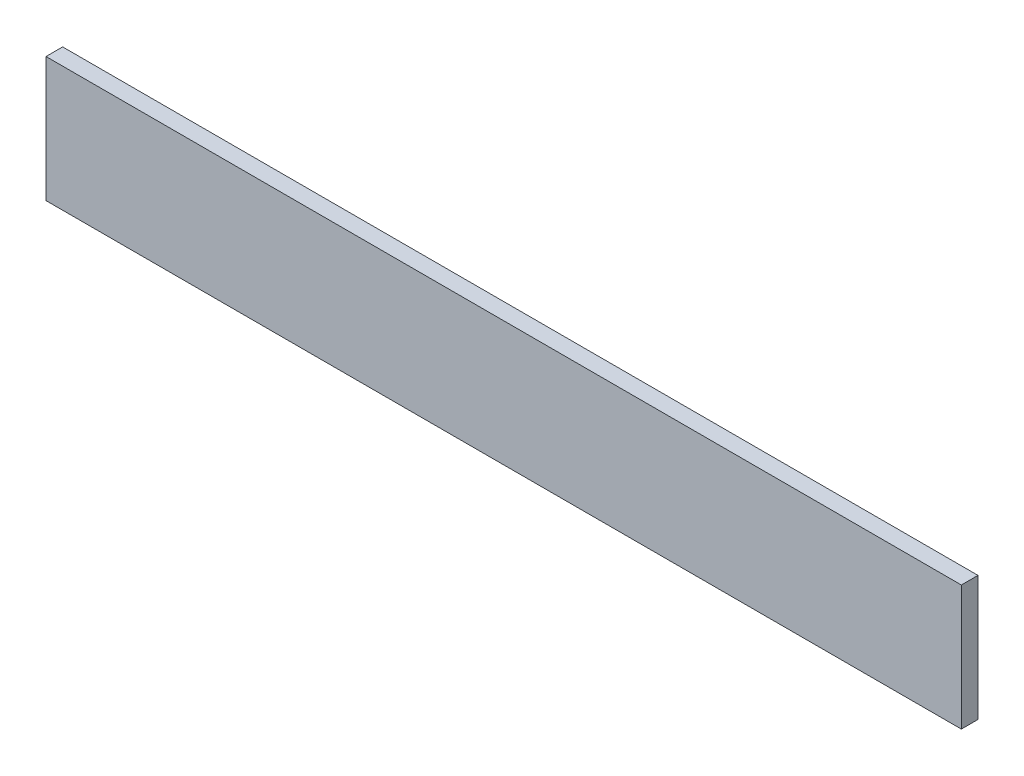
ISO-10303-21;
HEADER;
FILE_DESCRIPTION(('STEP AP214'),'2;1');
FILE_NAME('part.step','',(''),(''),'','','');
FILE_SCHEMA(('AUTOMOTIVE_DESIGN { 1 0 10303 214 1 1 1 1 }'));
ENDSEC;
DATA;
#1=APPLICATION_CONTEXT('core data for automotive mechanical design processes');
#2=APPLICATION_PROTOCOL_DEFINITION('international standard','automotive_design',2000,#1);
#3=PRODUCT_CONTEXT('',#1,'mechanical');
#4=PRODUCT('Part','Part','',(#3));
#5=PRODUCT_RELATED_PRODUCT_CATEGORY('part','',(#4));
#6=PRODUCT_DEFINITION_FORMATION('','',#4);
#7=PRODUCT_DEFINITION_CONTEXT('part definition',#1,'design');
#8=PRODUCT_DEFINITION('design','',#6,#7);
#9=PRODUCT_DEFINITION_SHAPE('','',#8);
#10=(LENGTH_UNIT() NAMED_UNIT(*) SI_UNIT(.MILLI.,.METRE.));
#11=(NAMED_UNIT(*) PLANE_ANGLE_UNIT() SI_UNIT($,.RADIAN.));
#12=(NAMED_UNIT(*) SI_UNIT($,.STERADIAN.) SOLID_ANGLE_UNIT());
#13=UNCERTAINTY_MEASURE_WITH_UNIT(LENGTH_MEASURE(1.E-05),#10,'distance_accuracy_value','');
#14=(GEOMETRIC_REPRESENTATION_CONTEXT(3) GLOBAL_UNCERTAINTY_ASSIGNED_CONTEXT((#13)) GLOBAL_UNIT_ASSIGNED_CONTEXT((#10,
#11,#12)) REPRESENTATION_CONTEXT('',''));
#15=CARTESIAN_POINT('',(0.,0.,0.));
#16=DIRECTION('',(0.,0.,1.));
#17=DIRECTION('',(1.,0.,0.));
#18=AXIS2_PLACEMENT_3D('',#15,#16,#17);
#19=CARTESIAN_POINT('',(0.,0.,4.));
#20=DIRECTION('',(1.,0.,0.));
#21=DIRECTION('',(0.,0.,-1.));
#22=AXIS2_PLACEMENT_3D('',#19,#20,#21);
#23=PLANE('',#22);
#24=DIRECTION('',(0.,-1.,0.));
#25=VECTOR('',#24,1.);
#26=CARTESIAN_POINT('',(0.,0.,0.));
#27=LINE('',#26,#25);
#28=CARTESIAN_POINT('',(0.,0.,0.));
#29=VERTEX_POINT('',#28);
#30=CARTESIAN_POINT('',(0.,-30.,0.));
#31=VERTEX_POINT('',#30);
#32=EDGE_CURVE('E113',#29,#31,#27,.T.);
#33=ORIENTED_EDGE('',*,*,#32,.T.);
#34=DIRECTION('',(0.,0.,-1.));
#35=VECTOR('',#34,1.);
#36=CARTESIAN_POINT('',(0.,-30.,4.));
#37=LINE('',#36,#35);
#38=CARTESIAN_POINT('',(0.,-30.,4.));
#39=VERTEX_POINT('',#38);
#40=EDGE_CURVE('E11',#39,#31,#37,.T.);
#41=ORIENTED_EDGE('',*,*,#40,.F.);
#42=DIRECTION('',(0.,-1.,0.));
#43=VECTOR('',#42,1.);
#44=CARTESIAN_POINT('',(0.,0.,4.));
#45=LINE('',#44,#43);
#46=CARTESIAN_POINT('',(0.,0.,4.));
#47=VERTEX_POINT('',#46);
#48=EDGE_CURVE('E97',#47,#39,#45,.T.);
#49=ORIENTED_EDGE('',*,*,#48,.F.);
#50=DIRECTION('',(0.,0.,-1.));
#51=VECTOR('',#50,1.);
#52=CARTESIAN_POINT('',(0.,0.,4.));
#53=LINE('',#52,#51);
#54=EDGE_CURVE('E109',#47,#29,#53,.T.);
#55=ORIENTED_EDGE('',*,*,#54,.T.);
#56=EDGE_LOOP('',(#33,#41,#49,#55));
#57=FACE_BOUND('',#56,.T.);
#58=ADVANCED_FACE('F45',(#57),#23,.F.);
#59=CARTESIAN_POINT('',(0.,-30.,4.));
#60=DIRECTION('',(0.,1.,0.));
#61=DIRECTION('',(0.,0.,1.));
#62=AXIS2_PLACEMENT_3D('',#59,#60,#61);
#63=PLANE('',#62);
#64=DIRECTION('',(1.,0.,0.));
#65=VECTOR('',#64,1.);
#66=CARTESIAN_POINT('',(0.,-30.,0.));
#67=LINE('',#66,#65);
#68=CARTESIAN_POINT('',(220.,-30.,0.));
#69=VERTEX_POINT('',#68);
#70=EDGE_CURVE('E102',#31,#69,#67,.T.);
#71=ORIENTED_EDGE('',*,*,#70,.T.);
#72=DIRECTION('',(0.,0.,-1.));
#73=VECTOR('',#72,1.);
#74=CARTESIAN_POINT('',(220.,-30.,4.));
#75=LINE('',#74,#73);
#76=CARTESIAN_POINT('',(220.,-30.,4.));
#77=VERTEX_POINT('',#76);
#78=EDGE_CURVE('E54',#77,#69,#75,.T.);
#79=ORIENTED_EDGE('',*,*,#78,.F.);
#80=DIRECTION('',(1.,0.,0.));
#81=VECTOR('',#80,1.);
#82=CARTESIAN_POINT('',(0.,-30.,4.));
#83=LINE('',#82,#81);
#84=EDGE_CURVE('E92',#39,#77,#83,.T.);
#85=ORIENTED_EDGE('',*,*,#84,.F.);
#86=ORIENTED_EDGE('',*,*,#40,.T.);
#87=EDGE_LOOP('',(#71,#79,#85,#86));
#88=FACE_BOUND('',#87,.T.);
#89=ADVANCED_FACE('F101',(#88),#63,.F.);
#90=CARTESIAN_POINT('',(220.,0.,4.));
#91=DIRECTION('',(-1.,0.,0.));
#92=DIRECTION('',(0.,0.,1.));
#93=AXIS2_PLACEMENT_3D('',#90,#91,#92);
#94=PLANE('',#93);
#95=DIRECTION('',(0.,1.,0.));
#96=VECTOR('',#95,1.);
#97=CARTESIAN_POINT('',(220.,0.,0.));
#98=LINE('',#97,#96);
#99=CARTESIAN_POINT('',(220.,0.,0.));
#100=VERTEX_POINT('',#99);
#101=EDGE_CURVE('E79',#69,#100,#98,.T.);
#102=ORIENTED_EDGE('',*,*,#101,.T.);
#103=DIRECTION('',(0.,0.,-1.));
#104=VECTOR('',#103,1.);
#105=CARTESIAN_POINT('',(220.,0.,4.));
#106=LINE('',#105,#104);
#107=CARTESIAN_POINT('',(220.,0.,4.));
#108=VERTEX_POINT('',#107);
#109=EDGE_CURVE('E104',#108,#100,#106,.T.);
#110=ORIENTED_EDGE('',*,*,#109,.F.);
#111=DIRECTION('',(0.,1.,0.));
#112=VECTOR('',#111,1.);
#113=CARTESIAN_POINT('',(220.,0.,4.));
#114=LINE('',#113,#112);
#115=EDGE_CURVE('E95',#77,#108,#114,.T.);
#116=ORIENTED_EDGE('',*,*,#115,.F.);
#117=ORIENTED_EDGE('',*,*,#78,.T.);
#118=EDGE_LOOP('',(#102,#110,#116,#117));
#119=FACE_BOUND('',#118,.T.);
#120=ADVANCED_FACE('F105',(#119),#94,.F.);
#121=CARTESIAN_POINT('',(0.,0.,4.));
#122=DIRECTION('',(0.,-1.,0.));
#123=DIRECTION('',(0.,0.,-1.));
#124=AXIS2_PLACEMENT_3D('',#121,#122,#123);
#125=PLANE('',#124);
#126=DIRECTION('',(-1.,0.,0.));
#127=VECTOR('',#126,1.);
#128=CARTESIAN_POINT('',(0.,0.,0.));
#129=LINE('',#128,#127);
#130=EDGE_CURVE('E85',#100,#29,#129,.T.);
#131=ORIENTED_EDGE('',*,*,#130,.T.);
#132=ORIENTED_EDGE('',*,*,#54,.F.);
#133=DIRECTION('',(-1.,0.,0.));
#134=VECTOR('',#133,1.);
#135=CARTESIAN_POINT('',(0.,0.,4.));
#136=LINE('',#135,#134);
#137=EDGE_CURVE('E62',#108,#47,#136,.T.);
#138=ORIENTED_EDGE('',*,*,#137,.F.);
#139=ORIENTED_EDGE('',*,*,#109,.T.);
#140=EDGE_LOOP('',(#131,#132,#138,#139));
#141=FACE_BOUND('',#140,.T.);
#142=ADVANCED_FACE('F126',(#141),#125,.F.);
#143=CARTESIAN_POINT('',(0.,0.,4.));
#144=DIRECTION('',(0.,0.,1.));
#145=DIRECTION('',(1.,0.,0.));
#146=AXIS2_PLACEMENT_3D('',#143,#144,#145);
#147=PLANE('',#146);
#148=ORIENTED_EDGE('',*,*,#48,.T.);
#149=ORIENTED_EDGE('',*,*,#84,.T.);
#150=ORIENTED_EDGE('',*,*,#115,.T.);
#151=ORIENTED_EDGE('',*,*,#137,.T.);
#152=EDGE_LOOP('',(#148,#149,#150,#151));
#153=FACE_BOUND('',#152,.T.);
#154=ADVANCED_FACE('F93',(#153),#147,.T.);
#155=CARTESIAN_POINT('',(0.,0.,0.));
#156=DIRECTION('',(0.,0.,1.));
#157=DIRECTION('',(1.,0.,0.));
#158=AXIS2_PLACEMENT_3D('',#155,#156,#157);
#159=PLANE('',#158);
#160=ORIENTED_EDGE('',*,*,#32,.F.);
#161=ORIENTED_EDGE('',*,*,#130,.F.);
#162=ORIENTED_EDGE('',*,*,#101,.F.);
#163=ORIENTED_EDGE('',*,*,#70,.F.);
#164=EDGE_LOOP('',(#160,#161,#162,#163));
#165=FACE_BOUND('',#164,.T.);
#166=ADVANCED_FACE('F129',(#165),#159,.F.);
#167=CLOSED_SHELL('',(#58,#89,#120,#142,#154,#166));
#168=MANIFOLD_SOLID_BREP('B2',#167);
#169=ADVANCED_BREP_SHAPE_REPRESENTATION('',(#18,#168),#14);
#170=SHAPE_DEFINITION_REPRESENTATION(#9,#169);
ENDSEC;
END-ISO-10303-21;
